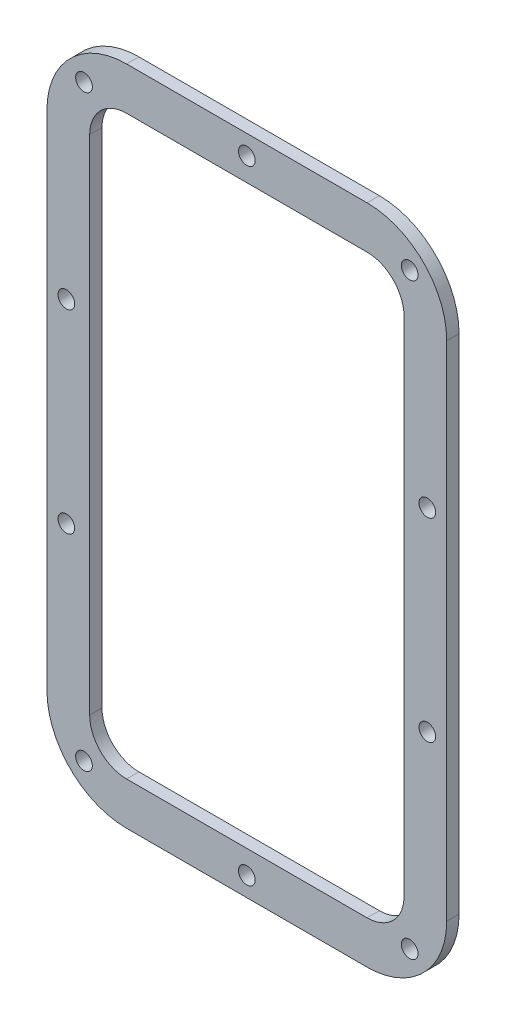
ISO-10303-21;
HEADER;
FILE_DESCRIPTION(('STEP AP214'),'2;1');
FILE_NAME('part.step','',(''),(''),'','','');
FILE_SCHEMA(('AUTOMOTIVE_DESIGN { 1 0 10303 214 1 1 1 1 }'));
ENDSEC;
DATA;
#1=APPLICATION_CONTEXT('core data for automotive mechanical design processes');
#2=APPLICATION_PROTOCOL_DEFINITION('international standard','automotive_design',2000,#1);
#3=PRODUCT_CONTEXT('',#1,'mechanical');
#4=PRODUCT('Part','Part','',(#3));
#5=PRODUCT_RELATED_PRODUCT_CATEGORY('part','',(#4));
#6=PRODUCT_DEFINITION_FORMATION('','',#4);
#7=PRODUCT_DEFINITION_CONTEXT('part definition',#1,'design');
#8=PRODUCT_DEFINITION('design','',#6,#7);
#9=PRODUCT_DEFINITION_SHAPE('','',#8);
#10=(LENGTH_UNIT() NAMED_UNIT(*) SI_UNIT(.MILLI.,.METRE.));
#11=(NAMED_UNIT(*) PLANE_ANGLE_UNIT() SI_UNIT($,.RADIAN.));
#12=(NAMED_UNIT(*) SI_UNIT($,.STERADIAN.) SOLID_ANGLE_UNIT());
#13=UNCERTAINTY_MEASURE_WITH_UNIT(LENGTH_MEASURE(1.E-05),#10,'distance_accuracy_value','');
#14=(GEOMETRIC_REPRESENTATION_CONTEXT(3) GLOBAL_UNCERTAINTY_ASSIGNED_CONTEXT((#13)) GLOBAL_UNIT_ASSIGNED_CONTEXT((#10,
#11,#12)) REPRESENTATION_CONTEXT('',''));
#15=CARTESIAN_POINT('',(0.,0.,0.));
#16=DIRECTION('',(0.,0.,1.));
#17=DIRECTION('',(1.,0.,0.));
#18=AXIS2_PLACEMENT_3D('',#15,#16,#17);
#19=CARTESIAN_POINT('',(32.5,-5.36127516449335,6.175));
#20=DIRECTION('',(0.,0.,1.));
#21=DIRECTION('',(1.,0.,0.));
#22=AXIS2_PLACEMENT_3D('',#19,#20,#21);
#23=PLANE('',#22);
#24=CARTESIAN_POINT('',(43.4601551083916,135.010155103898,6.175));
#25=DIRECTION('',(0.,0.,1.));
#26=DIRECTION('',(1.,0.,0.));
#27=AXIS2_PLACEMENT_3D('',#24,#25,#26);
#28=CIRCLE('',#27,2.15000000000003);
#29=CARTESIAN_POINT('',(45.6101551083916,135.010155103898,6.175));
#30=VERTEX_POINT('',#29);
#31=EDGE_CURVE('E218',#30,#30,#28,.T.);
#32=ORIENTED_EDGE('',*,*,#31,.F.);
#33=EDGE_LOOP('',(#32));
#34=FACE_BOUND('',#33,.T.);
#35=CARTESIAN_POINT('',(43.4601551083916,-16.3214302728847,6.175));
#36=DIRECTION('',(0.,0.,1.));
#37=DIRECTION('',(1.,0.,0.));
#38=AXIS2_PLACEMENT_3D('',#35,#36,#37);
#39=CIRCLE('',#38,2.15);
#40=CARTESIAN_POINT('',(45.6101551083916,-16.3214302728847,6.175));
#41=VERTEX_POINT('',#40);
#42=EDGE_CURVE('E230',#41,#41,#39,.T.);
#43=ORIENTED_EDGE('',*,*,#42,.F.);
#44=EDGE_LOOP('',(#43));
#45=FACE_BOUND('',#44,.T.);
#46=CARTESIAN_POINT('',(-40.3834791264749,-16.3214302728847,6.175));
#47=DIRECTION('',(0.,0.,1.));
#48=DIRECTION('',(1.,0.,0.));
#49=AXIS2_PLACEMENT_3D('',#46,#47,#48);
#50=CIRCLE('',#49,2.15);
#51=CARTESIAN_POINT('',(-38.2334791264749,-16.3214302728847,6.175));
#52=VERTEX_POINT('',#51);
#53=EDGE_CURVE('E242',#52,#52,#50,.T.);
#54=ORIENTED_EDGE('',*,*,#53,.F.);
#55=EDGE_LOOP('',(#54));
#56=FACE_BOUND('',#55,.T.);
#57=CARTESIAN_POINT('',(-40.3834791264749,135.010155103898,6.175));
#58=DIRECTION('',(0.,0.,1.));
#59=DIRECTION('',(1.,0.,0.));
#60=AXIS2_PLACEMENT_3D('',#57,#58,#59);
#61=CIRCLE('',#60,2.15000000000003);
#62=CARTESIAN_POINT('',(-38.2334791264749,135.010155103898,6.175));
#63=VERTEX_POINT('',#62);
#64=EDGE_CURVE('E254',#63,#63,#61,.T.);
#65=ORIENTED_EDGE('',*,*,#64,.F.);
#66=EDGE_LOOP('',(#65));
#67=FACE_BOUND('',#66,.T.);
#68=CARTESIAN_POINT('',(1.53833799095834,139.549999995507,6.175));
#69=DIRECTION('',(0.,0.,1.));
#70=DIRECTION('',(1.,0.,0.));
#71=AXIS2_PLACEMENT_3D('',#68,#69,#70);
#72=CIRCLE('',#71,2.14999999999997);
#73=CARTESIAN_POINT('',(3.68833799095831,139.549999995507,6.175));
#74=VERTEX_POINT('',#73);
#75=EDGE_CURVE('E266',#74,#74,#72,.T.);
#76=ORIENTED_EDGE('',*,*,#75,.F.);
#77=EDGE_LOOP('',(#76));
#78=FACE_BOUND('',#77,.T.);
#79=CARTESIAN_POINT('',(32.5,-5.36127516449335,6.175));
#80=DIRECTION('',(0.,0.,1.));
#81=DIRECTION('',(1.,0.,0.));
#82=AXIS2_PLACEMENT_3D('',#79,#80,#81);
#83=CIRCLE('',#82,20.5);
#84=CARTESIAN_POINT('',(32.5000000000273,-25.8612751645384,6.175));
#85=VERTEX_POINT('',#84);
#86=CARTESIAN_POINT('',(53.0000000000129,-5.36127516448914,6.175));
#87=VERTEX_POINT('',#86);
#88=EDGE_CURVE('E272',#85,#87,#83,.T.);
#89=ORIENTED_EDGE('',*,*,#88,.T.);
#90=DIRECTION('',(0.,-1.,0.));
#91=VECTOR('',#90,1.);
#92=CARTESIAN_POINT('',(52.9999999999973,-291471.1,6.175));
#93=LINE('',#92,#91);
#94=CARTESIAN_POINT('',(53.,124.04999999552,6.175));
#95=VERTEX_POINT('',#94);
#96=EDGE_CURVE('E274',#95,#87,#93,.T.);
#97=ORIENTED_EDGE('',*,*,#96,.F.);
#98=CARTESIAN_POINT('',(32.5,124.049999995507,6.175));
#99=DIRECTION('',(0.,0.,1.));
#100=DIRECTION('',(1.,0.,0.));
#101=AXIS2_PLACEMENT_3D('',#98,#99,#100);
#102=CIRCLE('',#101,20.5);
#103=CARTESIAN_POINT('',(32.5000000000273,144.54999999549,6.175));
#104=VERTEX_POINT('',#103);
#105=EDGE_CURVE('E278',#95,#104,#102,.T.);
#106=ORIENTED_EDGE('',*,*,#105,.T.);
#107=DIRECTION('',(1.,0.,0.));
#108=VECTOR('',#107,1.);
#109=CARTESIAN_POINT('',(-400000.538337991,144.54999999549,6.175));
#110=LINE('',#109,#108);
#111=CARTESIAN_POINT('',(-29.4233240180688,144.549999995507,6.175));
#112=VERTEX_POINT('',#111);
#113=EDGE_CURVE('E280',#112,#104,#110,.T.);
#114=ORIENTED_EDGE('',*,*,#113,.F.);
#115=CARTESIAN_POINT('',(-29.4233240180834,124.049999995507,6.175));
#116=DIRECTION('',(0.,0.,1.));
#117=DIRECTION('',(1.,0.,0.));
#118=AXIS2_PLACEMENT_3D('',#115,#116,#117);
#119=CIRCLE('',#118,20.5);
#120=CARTESIAN_POINT('',(-49.9233240180956,124.04999999552,6.175));
#121=VERTEX_POINT('',#120);
#122=EDGE_CURVE('E283',#112,#121,#119,.T.);
#123=ORIENTED_EDGE('',*,*,#122,.T.);
#124=DIRECTION('',(0.,1.,0.));
#125=VECTOR('',#124,1.);
#126=CARTESIAN_POINT('',(-49.9233240180956,-291471.1,6.175));
#127=LINE('',#126,#125);
#128=CARTESIAN_POINT('',(-49.9233240180834,-5.36127516448915,6.175));
#129=VERTEX_POINT('',#128);
#130=EDGE_CURVE('E285',#129,#121,#127,.T.);
#131=ORIENTED_EDGE('',*,*,#130,.F.);
#132=CARTESIAN_POINT('',(-29.4233240180834,-5.36127516449333,6.175));
#133=DIRECTION('',(0.,0.,1.));
#134=DIRECTION('',(1.,0.,0.));
#135=AXIS2_PLACEMENT_3D('',#132,#133,#134);
#136=CIRCLE('',#135,20.5);
#137=CARTESIAN_POINT('',(-29.4233240181256,-25.8612751645384,6.175));
#138=VERTEX_POINT('',#137);
#139=EDGE_CURVE('E288',#129,#138,#136,.T.);
#140=ORIENTED_EDGE('',*,*,#139,.T.);
#141=DIRECTION('',(-1.,0.,0.));
#142=VECTOR('',#141,1.);
#143=CARTESIAN_POINT('',(-400000.538337991,-25.861275164516,6.175));
#144=LINE('',#143,#142);
#145=EDGE_CURVE('E290',#85,#138,#144,.T.);
#146=ORIENTED_EDGE('',*,*,#145,.F.);
#147=EDGE_LOOP('',(#89,#97,#106,#114,#123,#131,#140,#146));
#148=FACE_BOUND('',#147,.T.);
#149=CARTESIAN_POINT('',(-44.9233240180834,84.3443624155067,6.175));
#150=DIRECTION('',(0.,0.,1.));
#151=DIRECTION('',(1.,0.,0.));
#152=AXIS2_PLACEMENT_3D('',#149,#150,#151);
#153=CIRCLE('',#152,2.15);
#154=CARTESIAN_POINT('',(-42.7733240180834,84.3443624155067,6.175));
#155=VERTEX_POINT('',#154);
#156=EDGE_CURVE('E260',#155,#155,#153,.T.);
#157=ORIENTED_EDGE('',*,*,#156,.F.);
#158=EDGE_LOOP('',(#157));
#159=FACE_BOUND('',#158,.T.);
#160=CARTESIAN_POINT('',(-44.9233240180834,34.3443624155067,6.175));
#161=DIRECTION('',(0.,0.,1.));
#162=DIRECTION('',(1.,0.,0.));
#163=AXIS2_PLACEMENT_3D('',#160,#161,#162);
#164=CIRCLE('',#163,2.15);
#165=CARTESIAN_POINT('',(-42.7733240180834,34.3443624155067,6.175));
#166=VERTEX_POINT('',#165);
#167=EDGE_CURVE('E248',#166,#166,#164,.T.);
#168=ORIENTED_EDGE('',*,*,#167,.F.);
#169=EDGE_LOOP('',(#168));
#170=FACE_BOUND('',#169,.T.);
#171=CARTESIAN_POINT('',(1.53833799095834,-20.8612751644933,6.175));
#172=DIRECTION('',(0.,0.,1.));
#173=DIRECTION('',(1.,0.,0.));
#174=AXIS2_PLACEMENT_3D('',#171,#172,#173);
#175=CIRCLE('',#174,2.15);
#176=CARTESIAN_POINT('',(3.68833799095834,-20.8612751644933,6.175));
#177=VERTEX_POINT('',#176);
#178=EDGE_CURVE('E236',#177,#177,#175,.T.);
#179=ORIENTED_EDGE('',*,*,#178,.F.);
#180=EDGE_LOOP('',(#179));
#181=FACE_BOUND('',#180,.T.);
#182=CARTESIAN_POINT('',(48.,34.3443624155066,6.175));
#183=DIRECTION('',(0.,0.,1.));
#184=DIRECTION('',(1.,0.,0.));
#185=AXIS2_PLACEMENT_3D('',#182,#183,#184);
#186=CIRCLE('',#185,2.15);
#187=CARTESIAN_POINT('',(50.15,34.3443624155066,6.175));
#188=VERTEX_POINT('',#187);
#189=EDGE_CURVE('E224',#188,#188,#186,.T.);
#190=ORIENTED_EDGE('',*,*,#189,.F.);
#191=EDGE_LOOP('',(#190));
#192=FACE_BOUND('',#191,.T.);
#193=CARTESIAN_POINT('',(48.,84.3443624155067,6.175));
#194=DIRECTION('',(0.,0.,1.));
#195=DIRECTION('',(1.,0.,0.));
#196=AXIS2_PLACEMENT_3D('',#193,#194,#195);
#197=CIRCLE('',#196,2.15);
#198=CARTESIAN_POINT('',(50.15,84.3443624155067,6.175));
#199=VERTEX_POINT('',#198);
#200=EDGE_CURVE('E212',#199,#199,#197,.T.);
#201=ORIENTED_EDGE('',*,*,#200,.F.);
#202=EDGE_LOOP('',(#201));
#203=FACE_BOUND('',#202,.T.);
#204=DIRECTION('',(0.,-1.,0.));
#205=VECTOR('',#204,1.);
#206=CARTESIAN_POINT('',(41.9999999999732,-291471.1,6.175));
#207=LINE('',#206,#205);
#208=CARTESIAN_POINT('',(42.,124.04999999552,6.175));
#209=VERTEX_POINT('',#208);
#210=CARTESIAN_POINT('',(41.9999999999732,-5.36127516448914,6.175));
#211=VERTEX_POINT('',#210);
#212=EDGE_CURVE('E155',#209,#211,#207,.T.);
#213=ORIENTED_EDGE('',*,*,#212,.T.);
#214=CARTESIAN_POINT('',(32.5000000000001,-5.36127516449332,6.175));
#215=DIRECTION('',(0.,0.,1.));
#216=DIRECTION('',(1.,0.,0.));
#217=AXIS2_PLACEMENT_3D('',#214,#215,#216);
#218=CIRCLE('',#217,9.5);
#219=CARTESIAN_POINT('',(32.5000000000273,-14.8612751644703,6.175));
#220=VERTEX_POINT('',#219);
#221=EDGE_CURVE('E146',#220,#211,#218,.T.);
#222=ORIENTED_EDGE('',*,*,#221,.F.);
#223=DIRECTION('',(-1.,0.,0.));
#224=VECTOR('',#223,1.);
#225=CARTESIAN_POINT('',(-400000.538337991,-14.8612751645487,6.175));
#226=LINE('',#225,#224);
#227=CARTESIAN_POINT('',(-29.4233240181256,-14.8612751644703,6.175));
#228=VERTEX_POINT('',#227);
#229=EDGE_CURVE('E181',#220,#228,#226,.T.);
#230=ORIENTED_EDGE('',*,*,#229,.T.);
#231=CARTESIAN_POINT('',(-29.4233240180833,-5.36127516449333,6.175));
#232=DIRECTION('',(0.,0.,1.));
#233=DIRECTION('',(1.,0.,0.));
#234=AXIS2_PLACEMENT_3D('',#231,#232,#233);
#235=CIRCLE('',#234,9.5);
#236=CARTESIAN_POINT('',(-38.9233240180833,-5.36127516448914,6.175));
#237=VERTEX_POINT('',#236);
#238=EDGE_CURVE('E179',#237,#228,#235,.T.);
#239=ORIENTED_EDGE('',*,*,#238,.F.);
#240=DIRECTION('',(0.,1.,0.));
#241=VECTOR('',#240,1.);
#242=CARTESIAN_POINT('',(-38.9233240180147,-291471.1,6.175));
#243=LINE('',#242,#241);
#244=CARTESIAN_POINT('',(-38.9233240180772,124.04999999552,6.175));
#245=VERTEX_POINT('',#244);
#246=EDGE_CURVE('E176',#237,#245,#243,.T.);
#247=ORIENTED_EDGE('',*,*,#246,.T.);
#248=CARTESIAN_POINT('',(-29.4233240180834,124.049999995507,6.175));
#249=DIRECTION('',(0.,0.,1.));
#250=DIRECTION('',(1.,0.,0.));
#251=AXIS2_PLACEMENT_3D('',#248,#249,#250);
#252=CIRCLE('',#251,9.5);
#253=CARTESIAN_POINT('',(-29.4233240180688,133.549999995507,6.175));
#254=VERTEX_POINT('',#253);
#255=EDGE_CURVE('E174',#254,#245,#252,.T.);
#256=ORIENTED_EDGE('',*,*,#255,.F.);
#257=DIRECTION('',(1.,0.,0.));
#258=VECTOR('',#257,1.);
#259=CARTESIAN_POINT('',(-400000.538337991,133.549999995523,6.175));
#260=LINE('',#259,#258);
#261=CARTESIAN_POINT('',(32.5000000000273,133.549999995523,6.175));
#262=VERTEX_POINT('',#261);
#263=EDGE_CURVE('E170',#254,#262,#260,.T.);
#264=ORIENTED_EDGE('',*,*,#263,.T.);
#265=CARTESIAN_POINT('',(32.5000000000001,124.049999995507,6.175));
#266=DIRECTION('',(0.,0.,1.));
#267=DIRECTION('',(1.,0.,0.));
#268=AXIS2_PLACEMENT_3D('',#265,#266,#267);
#269=CIRCLE('',#268,9.49999999999999);
#270=EDGE_CURVE('E168',#209,#262,#269,.T.);
#271=ORIENTED_EDGE('',*,*,#270,.F.);
#272=EDGE_LOOP('',(#213,#222,#230,#239,#247,#256,#264,#271));
#273=FACE_BOUND('',#272,.T.);
#274=ADVANCED_FACE('F35',(#34,#45,#56,#67,#78,#148,#159,#170,#181,#192,#203,#273),#23,.T.);
#275=CARTESIAN_POINT('',(32.5,-5.36127516449335,3.));
#276=DIRECTION('',(0.,0.,1.));
#277=DIRECTION('',(1.,0.,0.));
#278=AXIS2_PLACEMENT_3D('',#275,#276,#277);
#279=PLANE('',#278);
#280=CARTESIAN_POINT('',(48.,84.3443624155067,3.));
#281=DIRECTION('',(0.,0.,1.));
#282=DIRECTION('',(1.,0.,0.));
#283=AXIS2_PLACEMENT_3D('',#280,#281,#282);
#284=CIRCLE('',#283,2.15);
#285=CARTESIAN_POINT('',(50.15,84.3443624155067,3.));
#286=VERTEX_POINT('',#285);
#287=EDGE_CURVE('E164',#286,#286,#284,.T.);
#288=ORIENTED_EDGE('',*,*,#287,.T.);
#289=EDGE_LOOP('',(#288));
#290=FACE_BOUND('',#289,.T.);
#291=CARTESIAN_POINT('',(43.4601551083916,135.010155103898,3.));
#292=DIRECTION('',(0.,0.,1.));
#293=DIRECTION('',(1.,0.,0.));
#294=AXIS2_PLACEMENT_3D('',#291,#292,#293);
#295=CIRCLE('',#294,2.15000000000003);
#296=CARTESIAN_POINT('',(45.6101551083916,135.010155103898,3.));
#297=VERTEX_POINT('',#296);
#298=EDGE_CURVE('E215',#297,#297,#295,.T.);
#299=ORIENTED_EDGE('',*,*,#298,.T.);
#300=EDGE_LOOP('',(#299));
#301=FACE_BOUND('',#300,.T.);
#302=CARTESIAN_POINT('',(48.,34.3443624155066,3.));
#303=DIRECTION('',(0.,0.,1.));
#304=DIRECTION('',(1.,0.,0.));
#305=AXIS2_PLACEMENT_3D('',#302,#303,#304);
#306=CIRCLE('',#305,2.15);
#307=CARTESIAN_POINT('',(50.15,34.3443624155066,3.));
#308=VERTEX_POINT('',#307);
#309=EDGE_CURVE('E221',#308,#308,#306,.T.);
#310=ORIENTED_EDGE('',*,*,#309,.T.);
#311=EDGE_LOOP('',(#310));
#312=FACE_BOUND('',#311,.T.);
#313=CARTESIAN_POINT('',(43.4601551083916,-16.3214302728847,3.));
#314=DIRECTION('',(0.,0.,1.));
#315=DIRECTION('',(1.,0.,0.));
#316=AXIS2_PLACEMENT_3D('',#313,#314,#315);
#317=CIRCLE('',#316,2.15);
#318=CARTESIAN_POINT('',(45.6101551083916,-16.3214302728847,3.));
#319=VERTEX_POINT('',#318);
#320=EDGE_CURVE('E227',#319,#319,#317,.T.);
#321=ORIENTED_EDGE('',*,*,#320,.T.);
#322=EDGE_LOOP('',(#321));
#323=FACE_BOUND('',#322,.T.);
#324=CARTESIAN_POINT('',(1.53833799095834,-20.8612751644933,3.));
#325=DIRECTION('',(0.,0.,1.));
#326=DIRECTION('',(1.,0.,0.));
#327=AXIS2_PLACEMENT_3D('',#324,#325,#326);
#328=CIRCLE('',#327,2.15);
#329=CARTESIAN_POINT('',(3.68833799095834,-20.8612751644933,3.));
#330=VERTEX_POINT('',#329);
#331=EDGE_CURVE('E233',#330,#330,#328,.T.);
#332=ORIENTED_EDGE('',*,*,#331,.T.);
#333=EDGE_LOOP('',(#332));
#334=FACE_BOUND('',#333,.T.);
#335=CARTESIAN_POINT('',(-40.3834791264749,-16.3214302728847,3.));
#336=DIRECTION('',(0.,0.,1.));
#337=DIRECTION('',(1.,0.,0.));
#338=AXIS2_PLACEMENT_3D('',#335,#336,#337);
#339=CIRCLE('',#338,2.15);
#340=CARTESIAN_POINT('',(-38.2334791264749,-16.3214302728847,3.));
#341=VERTEX_POINT('',#340);
#342=EDGE_CURVE('E239',#341,#341,#339,.T.);
#343=ORIENTED_EDGE('',*,*,#342,.T.);
#344=EDGE_LOOP('',(#343));
#345=FACE_BOUND('',#344,.T.);
#346=CARTESIAN_POINT('',(-44.9233240180834,34.3443624155067,3.));
#347=DIRECTION('',(0.,0.,1.));
#348=DIRECTION('',(1.,0.,0.));
#349=AXIS2_PLACEMENT_3D('',#346,#347,#348);
#350=CIRCLE('',#349,2.15);
#351=CARTESIAN_POINT('',(-42.7733240180834,34.3443624155067,3.));
#352=VERTEX_POINT('',#351);
#353=EDGE_CURVE('E245',#352,#352,#350,.T.);
#354=ORIENTED_EDGE('',*,*,#353,.T.);
#355=EDGE_LOOP('',(#354));
#356=FACE_BOUND('',#355,.T.);
#357=CARTESIAN_POINT('',(-40.3834791264749,135.010155103898,3.));
#358=DIRECTION('',(0.,0.,1.));
#359=DIRECTION('',(1.,0.,0.));
#360=AXIS2_PLACEMENT_3D('',#357,#358,#359);
#361=CIRCLE('',#360,2.15000000000003);
#362=CARTESIAN_POINT('',(-38.2334791264749,135.010155103898,3.));
#363=VERTEX_POINT('',#362);
#364=EDGE_CURVE('E251',#363,#363,#361,.T.);
#365=ORIENTED_EDGE('',*,*,#364,.T.);
#366=EDGE_LOOP('',(#365));
#367=FACE_BOUND('',#366,.T.);
#368=CARTESIAN_POINT('',(-44.9233240180834,84.3443624155067,3.));
#369=DIRECTION('',(0.,0.,1.));
#370=DIRECTION('',(1.,0.,0.));
#371=AXIS2_PLACEMENT_3D('',#368,#369,#370);
#372=CIRCLE('',#371,2.15);
#373=CARTESIAN_POINT('',(-42.7733240180834,84.3443624155067,3.));
#374=VERTEX_POINT('',#373);
#375=EDGE_CURVE('E257',#374,#374,#372,.T.);
#376=ORIENTED_EDGE('',*,*,#375,.T.);
#377=EDGE_LOOP('',(#376));
#378=FACE_BOUND('',#377,.T.);
#379=CARTESIAN_POINT('',(1.53833799095834,139.549999995507,3.));
#380=DIRECTION('',(0.,0.,1.));
#381=DIRECTION('',(1.,0.,0.));
#382=AXIS2_PLACEMENT_3D('',#379,#380,#381);
#383=CIRCLE('',#382,2.14999999999997);
#384=CARTESIAN_POINT('',(3.68833799095831,139.549999995507,3.));
#385=VERTEX_POINT('',#384);
#386=EDGE_CURVE('E263',#385,#385,#383,.T.);
#387=ORIENTED_EDGE('',*,*,#386,.T.);
#388=EDGE_LOOP('',(#387));
#389=FACE_BOUND('',#388,.T.);
#390=CARTESIAN_POINT('',(32.5,-5.36127516449335,3.));
#391=DIRECTION('',(0.,0.,1.));
#392=DIRECTION('',(1.,0.,0.));
#393=AXIS2_PLACEMENT_3D('',#390,#391,#392);
#394=CIRCLE('',#393,20.5);
#395=CARTESIAN_POINT('',(32.5000000000273,-25.8612751645384,3.));
#396=VERTEX_POINT('',#395);
#397=CARTESIAN_POINT('',(53.0000000000129,-5.36127516448914,3.));
#398=VERTEX_POINT('',#397);
#399=EDGE_CURVE('E269',#396,#398,#394,.T.);
#400=ORIENTED_EDGE('',*,*,#399,.F.);
#401=DIRECTION('',(-1.,0.,0.));
#402=VECTOR('',#401,1.);
#403=CARTESIAN_POINT('',(-400000.538337991,-25.861275164516,3.));
#404=LINE('',#403,#402);
#405=CARTESIAN_POINT('',(-29.4233240181256,-25.8612751645384,3.));
#406=VERTEX_POINT('',#405);
#407=EDGE_CURVE('E275',#396,#406,#404,.T.);
#408=ORIENTED_EDGE('',*,*,#407,.T.);
#409=CARTESIAN_POINT('',(-29.4233240180834,-5.36127516449333,3.));
#410=DIRECTION('',(0.,0.,1.));
#411=DIRECTION('',(1.,0.,0.));
#412=AXIS2_PLACEMENT_3D('',#409,#410,#411);
#413=CIRCLE('',#412,20.5);
#414=CARTESIAN_POINT('',(-49.9233240180834,-5.36127516448915,3.));
#415=VERTEX_POINT('',#414);
#416=EDGE_CURVE('E311',#415,#406,#413,.T.);
#417=ORIENTED_EDGE('',*,*,#416,.F.);
#418=DIRECTION('',(0.,1.,0.));
#419=VECTOR('',#418,1.);
#420=CARTESIAN_POINT('',(-49.9233240180956,-291471.1,3.));
#421=LINE('',#420,#419);
#422=CARTESIAN_POINT('',(-49.9233240180956,124.04999999552,3.));
#423=VERTEX_POINT('',#422);
#424=EDGE_CURVE('E308',#415,#423,#421,.T.);
#425=ORIENTED_EDGE('',*,*,#424,.T.);
#426=CARTESIAN_POINT('',(-29.4233240180834,124.049999995507,3.));
#427=DIRECTION('',(0.,0.,1.));
#428=DIRECTION('',(1.,0.,0.));
#429=AXIS2_PLACEMENT_3D('',#426,#427,#428);
#430=CIRCLE('',#429,20.5);
#431=CARTESIAN_POINT('',(-29.4233240180688,144.549999995507,3.));
#432=VERTEX_POINT('',#431);
#433=EDGE_CURVE('E305',#432,#423,#430,.T.);
#434=ORIENTED_EDGE('',*,*,#433,.F.);
#435=DIRECTION('',(1.,0.,0.));
#436=VECTOR('',#435,1.);
#437=CARTESIAN_POINT('',(-400000.538337991,144.54999999549,3.));
#438=LINE('',#437,#436);
#439=CARTESIAN_POINT('',(32.5000000000273,144.54999999549,3.));
#440=VERTEX_POINT('',#439);
#441=EDGE_CURVE('E302',#432,#440,#438,.T.);
#442=ORIENTED_EDGE('',*,*,#441,.T.);
#443=CARTESIAN_POINT('',(32.5,124.049999995507,3.));
#444=DIRECTION('',(0.,0.,1.));
#445=DIRECTION('',(1.,0.,0.));
#446=AXIS2_PLACEMENT_3D('',#443,#444,#445);
#447=CIRCLE('',#446,20.5);
#448=CARTESIAN_POINT('',(53.,124.04999999552,3.));
#449=VERTEX_POINT('',#448);
#450=EDGE_CURVE('E299',#449,#440,#447,.T.);
#451=ORIENTED_EDGE('',*,*,#450,.F.);
#452=DIRECTION('',(0.,-1.,0.));
#453=VECTOR('',#452,1.);
#454=CARTESIAN_POINT('',(52.9999999999973,-291471.1,3.));
#455=LINE('',#454,#453);
#456=EDGE_CURVE('E296',#449,#398,#455,.T.);
#457=ORIENTED_EDGE('',*,*,#456,.T.);
#458=EDGE_LOOP('',(#400,#408,#417,#425,#434,#442,#451,#457));
#459=FACE_BOUND('',#458,.T.);
#460=CARTESIAN_POINT('',(32.5000000000001,-5.36127516449332,3.));
#461=DIRECTION('',(0.,0.,1.));
#462=DIRECTION('',(1.,0.,0.));
#463=AXIS2_PLACEMENT_3D('',#460,#461,#462);
#464=CIRCLE('',#463,9.5);
#465=CARTESIAN_POINT('',(32.5000000000273,-14.8612751644703,3.));
#466=VERTEX_POINT('',#465);
#467=CARTESIAN_POINT('',(41.9999999999732,-5.36127516448914,3.));
#468=VERTEX_POINT('',#467);
#469=EDGE_CURVE('E58',#466,#468,#464,.T.);
#470=ORIENTED_EDGE('',*,*,#469,.T.);
#471=DIRECTION('',(0.,-1.,0.));
#472=VECTOR('',#471,1.);
#473=CARTESIAN_POINT('',(41.9999999999732,-291471.1,3.));
#474=LINE('',#473,#472);
#475=CARTESIAN_POINT('',(42.,124.04999999552,3.));
#476=VERTEX_POINT('',#475);
#477=EDGE_CURVE('E163',#476,#468,#474,.T.);
#478=ORIENTED_EDGE('',*,*,#477,.F.);
#479=CARTESIAN_POINT('',(32.5000000000001,124.049999995507,3.));
#480=DIRECTION('',(0.,0.,1.));
#481=DIRECTION('',(1.,0.,0.));
#482=AXIS2_PLACEMENT_3D('',#479,#480,#481);
#483=CIRCLE('',#482,9.49999999999999);
#484=CARTESIAN_POINT('',(32.5000000000273,133.549999995523,3.));
#485=VERTEX_POINT('',#484);
#486=EDGE_CURVE('E185',#476,#485,#483,.T.);
#487=ORIENTED_EDGE('',*,*,#486,.T.);
#488=DIRECTION('',(1.,0.,0.));
#489=VECTOR('',#488,1.);
#490=CARTESIAN_POINT('',(-400000.538337991,133.549999995523,3.));
#491=LINE('',#490,#489);
#492=CARTESIAN_POINT('',(-29.4233240180688,133.549999995507,3.));
#493=VERTEX_POINT('',#492);
#494=EDGE_CURVE('E188',#493,#485,#491,.T.);
#495=ORIENTED_EDGE('',*,*,#494,.F.);
#496=CARTESIAN_POINT('',(-29.4233240180834,124.049999995507,3.));
#497=DIRECTION('',(0.,0.,1.));
#498=DIRECTION('',(1.,0.,0.));
#499=AXIS2_PLACEMENT_3D('',#496,#497,#498);
#500=CIRCLE('',#499,9.5);
#501=CARTESIAN_POINT('',(-38.9233240180772,124.04999999552,3.));
#502=VERTEX_POINT('',#501);
#503=EDGE_CURVE('E191',#493,#502,#500,.T.);
#504=ORIENTED_EDGE('',*,*,#503,.T.);
#505=DIRECTION('',(0.,1.,0.));
#506=VECTOR('',#505,1.);
#507=CARTESIAN_POINT('',(-38.9233240180147,-291471.1,3.));
#508=LINE('',#507,#506);
#509=CARTESIAN_POINT('',(-38.9233240180833,-5.36127516448914,3.));
#510=VERTEX_POINT('',#509);
#511=EDGE_CURVE('E194',#510,#502,#508,.T.);
#512=ORIENTED_EDGE('',*,*,#511,.F.);
#513=CARTESIAN_POINT('',(-29.4233240180833,-5.36127516449333,3.));
#514=DIRECTION('',(0.,0.,1.));
#515=DIRECTION('',(1.,0.,0.));
#516=AXIS2_PLACEMENT_3D('',#513,#514,#515);
#517=CIRCLE('',#516,9.5);
#518=CARTESIAN_POINT('',(-29.4233240181256,-14.8612751644703,3.));
#519=VERTEX_POINT('',#518);
#520=EDGE_CURVE('E197',#510,#519,#517,.T.);
#521=ORIENTED_EDGE('',*,*,#520,.T.);
#522=DIRECTION('',(-1.,0.,0.));
#523=VECTOR('',#522,1.);
#524=CARTESIAN_POINT('',(-400000.538337991,-14.8612751645487,3.));
#525=LINE('',#524,#523);
#526=EDGE_CURVE('E156',#466,#519,#525,.T.);
#527=ORIENTED_EDGE('',*,*,#526,.F.);
#528=EDGE_LOOP('',(#470,#478,#487,#495,#504,#512,#521,#527));
#529=FACE_BOUND('',#528,.T.);
#530=ADVANCED_FACE('F336',(#290,#301,#312,#323,#334,#345,#356,#367,#378,#389,#459,#529),#279,.F.);
#531=CARTESIAN_POINT('',(32.5,-5.36127516449335,6.175));
#532=DIRECTION('',(0.,0.,-1.));
#533=DIRECTION('',(-1.,0.,0.));
#534=AXIS2_PLACEMENT_3D('',#531,#532,#533);
#535=CYLINDRICAL_SURFACE('',#534,20.5);
#536=ORIENTED_EDGE('',*,*,#399,.T.);
#537=DIRECTION('',(0.,0.,-1.));
#538=VECTOR('',#537,1.);
#539=CARTESIAN_POINT('',(53.0000000000129,-5.36127516448914,6.175));
#540=LINE('',#539,#538);
#541=EDGE_CURVE('E11',#87,#398,#540,.T.);
#542=ORIENTED_EDGE('',*,*,#541,.F.);
#543=ORIENTED_EDGE('',*,*,#88,.F.);
#544=DIRECTION('',(0.,0.,-1.));
#545=VECTOR('',#544,1.);
#546=CARTESIAN_POINT('',(32.5000000000273,-25.8612751645384,6.175));
#547=LINE('',#546,#545);
#548=EDGE_CURVE('E293',#85,#396,#547,.T.);
#549=ORIENTED_EDGE('',*,*,#548,.T.);
#550=EDGE_LOOP('',(#536,#542,#543,#549));
#551=FACE_BOUND('',#550,.T.);
#552=ADVANCED_FACE('F37',(#551),#535,.T.);
#553=CARTESIAN_POINT('',(52.9999999999973,-291471.1,6.175));
#554=DIRECTION('',(1.,0.,0.));
#555=DIRECTION('',(0.,1.,0.));
#556=AXIS2_PLACEMENT_3D('',#553,#554,#555);
#557=PLANE('',#556);
#558=ORIENTED_EDGE('',*,*,#456,.F.);
#559=DIRECTION('',(0.,0.,-1.));
#560=VECTOR('',#559,1.);
#561=CARTESIAN_POINT('',(53.,124.04999999552,6.175));
#562=LINE('',#561,#560);
#563=EDGE_CURVE('E43',#95,#449,#562,.T.);
#564=ORIENTED_EDGE('',*,*,#563,.F.);
#565=ORIENTED_EDGE('',*,*,#96,.T.);
#566=ORIENTED_EDGE('',*,*,#541,.T.);
#567=EDGE_LOOP('',(#558,#564,#565,#566));
#568=FACE_BOUND('',#567,.T.);
#569=ADVANCED_FACE('F340',(#568),#557,.T.);
#570=CARTESIAN_POINT('',(32.5,124.049999995507,6.175));
#571=DIRECTION('',(0.,0.,-1.));
#572=DIRECTION('',(-1.,0.,0.));
#573=AXIS2_PLACEMENT_3D('',#570,#571,#572);
#574=CYLINDRICAL_SURFACE('',#573,20.5);
#575=ORIENTED_EDGE('',*,*,#450,.T.);
#576=DIRECTION('',(0.,0.,-1.));
#577=VECTOR('',#576,1.);
#578=CARTESIAN_POINT('',(32.5000000000273,144.54999999549,6.175));
#579=LINE('',#578,#577);
#580=EDGE_CURVE('E325',#104,#440,#579,.T.);
#581=ORIENTED_EDGE('',*,*,#580,.F.);
#582=ORIENTED_EDGE('',*,*,#105,.F.);
#583=ORIENTED_EDGE('',*,*,#563,.T.);
#584=EDGE_LOOP('',(#575,#581,#582,#583));
#585=FACE_BOUND('',#584,.T.);
#586=ADVANCED_FACE('F329',(#585),#574,.T.);
#587=CARTESIAN_POINT('',(-400000.538337991,144.54999999549,6.175));
#588=DIRECTION('',(0.,1.,0.));
#589=DIRECTION('',(0.,0.,1.));
#590=AXIS2_PLACEMENT_3D('',#587,#588,#589);
#591=PLANE('',#590);
#592=ORIENTED_EDGE('',*,*,#441,.F.);
#593=DIRECTION('',(0.,0.,-1.));
#594=VECTOR('',#593,1.);
#595=CARTESIAN_POINT('',(-29.4233240180688,144.549999995507,6.175));
#596=LINE('',#595,#594);
#597=EDGE_CURVE('E323',#112,#432,#596,.T.);
#598=ORIENTED_EDGE('',*,*,#597,.F.);
#599=ORIENTED_EDGE('',*,*,#113,.T.);
#600=ORIENTED_EDGE('',*,*,#580,.T.);
#601=EDGE_LOOP('',(#592,#598,#599,#600));
#602=FACE_BOUND('',#601,.T.);
#603=ADVANCED_FACE('F362',(#602),#591,.T.);
#604=CARTESIAN_POINT('',(-29.4233240180834,124.049999995507,6.175));
#605=DIRECTION('',(0.,0.,-1.));
#606=DIRECTION('',(-1.,0.,0.));
#607=AXIS2_PLACEMENT_3D('',#604,#605,#606);
#608=CYLINDRICAL_SURFACE('',#607,20.5);
#609=ORIENTED_EDGE('',*,*,#433,.T.);
#610=DIRECTION('',(0.,0.,-1.));
#611=VECTOR('',#610,1.);
#612=CARTESIAN_POINT('',(-49.9233240180956,124.04999999552,6.175));
#613=LINE('',#612,#611);
#614=EDGE_CURVE('E321',#121,#423,#613,.T.);
#615=ORIENTED_EDGE('',*,*,#614,.F.);
#616=ORIENTED_EDGE('',*,*,#122,.F.);
#617=ORIENTED_EDGE('',*,*,#597,.T.);
#618=EDGE_LOOP('',(#609,#615,#616,#617));
#619=FACE_BOUND('',#618,.T.);
#620=ADVANCED_FACE('F360',(#619),#608,.T.);
#621=CARTESIAN_POINT('',(-49.9233240180956,-291471.1,6.175));
#622=DIRECTION('',(-1.,0.,0.));
#623=DIRECTION('',(0.,0.,1.));
#624=AXIS2_PLACEMENT_3D('',#621,#622,#623);
#625=PLANE('',#624);
#626=ORIENTED_EDGE('',*,*,#424,.F.);
#627=DIRECTION('',(0.,0.,-1.));
#628=VECTOR('',#627,1.);
#629=CARTESIAN_POINT('',(-49.9233240180834,-5.36127516448915,6.175));
#630=LINE('',#629,#628);
#631=EDGE_CURVE('E319',#129,#415,#630,.T.);
#632=ORIENTED_EDGE('',*,*,#631,.F.);
#633=ORIENTED_EDGE('',*,*,#130,.T.);
#634=ORIENTED_EDGE('',*,*,#614,.T.);
#635=EDGE_LOOP('',(#626,#632,#633,#634));
#636=FACE_BOUND('',#635,.T.);
#637=ADVANCED_FACE('F355',(#636),#625,.T.);
#638=CARTESIAN_POINT('',(-29.4233240180834,-5.36127516449333,6.175));
#639=DIRECTION('',(0.,0.,-1.));
#640=DIRECTION('',(-1.,0.,0.));
#641=AXIS2_PLACEMENT_3D('',#638,#639,#640);
#642=CYLINDRICAL_SURFACE('',#641,20.5);
#643=ORIENTED_EDGE('',*,*,#416,.T.);
#644=DIRECTION('',(0.,0.,-1.));
#645=VECTOR('',#644,1.);
#646=CARTESIAN_POINT('',(-29.4233240181256,-25.8612751645384,6.175));
#647=LINE('',#646,#645);
#648=EDGE_CURVE('E317',#138,#406,#647,.T.);
#649=ORIENTED_EDGE('',*,*,#648,.F.);
#650=ORIENTED_EDGE('',*,*,#139,.F.);
#651=ORIENTED_EDGE('',*,*,#631,.T.);
#652=EDGE_LOOP('',(#643,#649,#650,#651));
#653=FACE_BOUND('',#652,.T.);
#654=ADVANCED_FACE('F352',(#653),#642,.T.);
#655=CARTESIAN_POINT('',(-400000.538337991,-25.861275164516,6.175));
#656=DIRECTION('',(0.,-1.,0.));
#657=DIRECTION('',(1.,0.,0.));
#658=AXIS2_PLACEMENT_3D('',#655,#656,#657);
#659=PLANE('',#658);
#660=ORIENTED_EDGE('',*,*,#407,.F.);
#661=ORIENTED_EDGE('',*,*,#548,.F.);
#662=ORIENTED_EDGE('',*,*,#145,.T.);
#663=ORIENTED_EDGE('',*,*,#648,.T.);
#664=EDGE_LOOP('',(#660,#661,#662,#663));
#665=FACE_BOUND('',#664,.T.);
#666=ADVANCED_FACE('F347',(#665),#659,.T.);
#667=CARTESIAN_POINT('',(1.53833799095834,139.549999995507,6.175));
#668=DIRECTION('',(0.,0.,-1.));
#669=DIRECTION('',(-1.,0.,0.));
#670=AXIS2_PLACEMENT_3D('',#667,#668,#669);
#671=CYLINDRICAL_SURFACE('',#670,2.14999999999997);
#672=ORIENTED_EDGE('',*,*,#75,.T.);
#673=EDGE_LOOP('',(#672));
#674=FACE_BOUND('',#673,.T.);
#675=ORIENTED_EDGE('',*,*,#386,.F.);
#676=EDGE_LOOP('',(#675));
#677=FACE_BOUND('',#676,.T.);
#678=ADVANCED_FACE('F407',(#674,#677),#671,.F.);
#679=CARTESIAN_POINT('',(-44.9233240180834,84.3443624155067,6.175));
#680=DIRECTION('',(0.,0.,-1.));
#681=DIRECTION('',(-1.,0.,0.));
#682=AXIS2_PLACEMENT_3D('',#679,#680,#681);
#683=CYLINDRICAL_SURFACE('',#682,2.15);
#684=ORIENTED_EDGE('',*,*,#156,.T.);
#685=EDGE_LOOP('',(#684));
#686=FACE_BOUND('',#685,.T.);
#687=ORIENTED_EDGE('',*,*,#375,.F.);
#688=EDGE_LOOP('',(#687));
#689=FACE_BOUND('',#688,.T.);
#690=ADVANCED_FACE('F409',(#686,#689),#683,.F.);
#691=CARTESIAN_POINT('',(-40.3834791264749,135.010155103898,6.175));
#692=DIRECTION('',(0.,0.,-1.));
#693=DIRECTION('',(-1.,0.,0.));
#694=AXIS2_PLACEMENT_3D('',#691,#692,#693);
#695=CYLINDRICAL_SURFACE('',#694,2.15000000000003);
#696=ORIENTED_EDGE('',*,*,#64,.T.);
#697=EDGE_LOOP('',(#696));
#698=FACE_BOUND('',#697,.T.);
#699=ORIENTED_EDGE('',*,*,#364,.F.);
#700=EDGE_LOOP('',(#699));
#701=FACE_BOUND('',#700,.T.);
#702=ADVANCED_FACE('F416',(#698,#701),#695,.F.);
#703=CARTESIAN_POINT('',(-44.9233240180834,34.3443624155067,6.175));
#704=DIRECTION('',(0.,0.,-1.));
#705=DIRECTION('',(-1.,0.,0.));
#706=AXIS2_PLACEMENT_3D('',#703,#704,#705);
#707=CYLINDRICAL_SURFACE('',#706,2.15);
#708=ORIENTED_EDGE('',*,*,#167,.T.);
#709=EDGE_LOOP('',(#708));
#710=FACE_BOUND('',#709,.T.);
#711=ORIENTED_EDGE('',*,*,#353,.F.);
#712=EDGE_LOOP('',(#711));
#713=FACE_BOUND('',#712,.T.);
#714=ADVANCED_FACE('F502',(#710,#713),#707,.F.);
#715=CARTESIAN_POINT('',(-40.3834791264749,-16.3214302728847,6.175));
#716=DIRECTION('',(0.,0.,-1.));
#717=DIRECTION('',(-1.,0.,0.));
#718=AXIS2_PLACEMENT_3D('',#715,#716,#717);
#719=CYLINDRICAL_SURFACE('',#718,2.15);
#720=ORIENTED_EDGE('',*,*,#53,.T.);
#721=EDGE_LOOP('',(#720));
#722=FACE_BOUND('',#721,.T.);
#723=ORIENTED_EDGE('',*,*,#342,.F.);
#724=EDGE_LOOP('',(#723));
#725=FACE_BOUND('',#724,.T.);
#726=ADVANCED_FACE('F510',(#722,#725),#719,.F.);
#727=CARTESIAN_POINT('',(1.53833799095834,-20.8612751644933,6.175));
#728=DIRECTION('',(0.,0.,-1.));
#729=DIRECTION('',(-1.,0.,0.));
#730=AXIS2_PLACEMENT_3D('',#727,#728,#729);
#731=CYLINDRICAL_SURFACE('',#730,2.15);
#732=ORIENTED_EDGE('',*,*,#178,.T.);
#733=EDGE_LOOP('',(#732));
#734=FACE_BOUND('',#733,.T.);
#735=ORIENTED_EDGE('',*,*,#331,.F.);
#736=EDGE_LOOP('',(#735));
#737=FACE_BOUND('',#736,.T.);
#738=ADVANCED_FACE('F519',(#734,#737),#731,.F.);
#739=CARTESIAN_POINT('',(43.4601551083916,-16.3214302728847,6.175));
#740=DIRECTION('',(0.,0.,-1.));
#741=DIRECTION('',(-1.,0.,0.));
#742=AXIS2_PLACEMENT_3D('',#739,#740,#741);
#743=CYLINDRICAL_SURFACE('',#742,2.15);
#744=ORIENTED_EDGE('',*,*,#42,.T.);
#745=EDGE_LOOP('',(#744));
#746=FACE_BOUND('',#745,.T.);
#747=ORIENTED_EDGE('',*,*,#320,.F.);
#748=EDGE_LOOP('',(#747));
#749=FACE_BOUND('',#748,.T.);
#750=ADVANCED_FACE('F528',(#746,#749),#743,.F.);
#751=CARTESIAN_POINT('',(48.,34.3443624155066,6.175));
#752=DIRECTION('',(0.,0.,-1.));
#753=DIRECTION('',(-1.,0.,0.));
#754=AXIS2_PLACEMENT_3D('',#751,#752,#753);
#755=CYLINDRICAL_SURFACE('',#754,2.15);
#756=ORIENTED_EDGE('',*,*,#189,.T.);
#757=EDGE_LOOP('',(#756));
#758=FACE_BOUND('',#757,.T.);
#759=ORIENTED_EDGE('',*,*,#309,.F.);
#760=EDGE_LOOP('',(#759));
#761=FACE_BOUND('',#760,.T.);
#762=ADVANCED_FACE('F537',(#758,#761),#755,.F.);
#763=CARTESIAN_POINT('',(43.4601551083916,135.010155103898,6.175));
#764=DIRECTION('',(0.,0.,-1.));
#765=DIRECTION('',(-1.,0.,0.));
#766=AXIS2_PLACEMENT_3D('',#763,#764,#765);
#767=CYLINDRICAL_SURFACE('',#766,2.15000000000003);
#768=ORIENTED_EDGE('',*,*,#31,.T.);
#769=EDGE_LOOP('',(#768));
#770=FACE_BOUND('',#769,.T.);
#771=ORIENTED_EDGE('',*,*,#298,.F.);
#772=EDGE_LOOP('',(#771));
#773=FACE_BOUND('',#772,.T.);
#774=ADVANCED_FACE('F382',(#770,#773),#767,.F.);
#775=CARTESIAN_POINT('',(48.,84.3443624155067,6.175));
#776=DIRECTION('',(0.,0.,-1.));
#777=DIRECTION('',(-1.,0.,0.));
#778=AXIS2_PLACEMENT_3D('',#775,#776,#777);
#779=CYLINDRICAL_SURFACE('',#778,2.15);
#780=ORIENTED_EDGE('',*,*,#200,.T.);
#781=EDGE_LOOP('',(#780));
#782=FACE_BOUND('',#781,.T.);
#783=ORIENTED_EDGE('',*,*,#287,.F.);
#784=EDGE_LOOP('',(#783));
#785=FACE_BOUND('',#784,.T.);
#786=ADVANCED_FACE('F379',(#782,#785),#779,.F.);
#787=CARTESIAN_POINT('',(32.5000000000001,-5.36127516449332,6.175));
#788=DIRECTION('',(0.,0.,-1.));
#789=DIRECTION('',(-1.,0.,0.));
#790=AXIS2_PLACEMENT_3D('',#787,#788,#789);
#791=CYLINDRICAL_SURFACE('',#790,9.5);
#792=ORIENTED_EDGE('',*,*,#469,.F.);
#793=DIRECTION('',(0.,0.,-1.));
#794=VECTOR('',#793,1.);
#795=CARTESIAN_POINT('',(32.5000000000273,-14.8612751644703,6.175));
#796=LINE('',#795,#794);
#797=EDGE_CURVE('E151',#220,#466,#796,.T.);
#798=ORIENTED_EDGE('',*,*,#797,.F.);
#799=ORIENTED_EDGE('',*,*,#221,.T.);
#800=DIRECTION('',(0.,0.,-1.));
#801=VECTOR('',#800,1.);
#802=CARTESIAN_POINT('',(41.9999999999732,-5.36127516448914,6.175));
#803=LINE('',#802,#801);
#804=EDGE_CURVE('E149',#211,#468,#803,.T.);
#805=ORIENTED_EDGE('',*,*,#804,.T.);
#806=EDGE_LOOP('',(#792,#798,#799,#805));
#807=FACE_BOUND('',#806,.T.);
#808=ADVANCED_FACE('F148',(#807),#791,.F.);
#809=CARTESIAN_POINT('',(41.9999999999732,-291471.1,6.175));
#810=DIRECTION('',(1.,0.,0.));
#811=DIRECTION('',(0.,0.,-1.));
#812=AXIS2_PLACEMENT_3D('',#809,#810,#811);
#813=PLANE('',#812);
#814=ORIENTED_EDGE('',*,*,#477,.T.);
#815=ORIENTED_EDGE('',*,*,#804,.F.);
#816=ORIENTED_EDGE('',*,*,#212,.F.);
#817=DIRECTION('',(0.,0.,-1.));
#818=VECTOR('',#817,1.);
#819=CARTESIAN_POINT('',(42.,124.04999999552,6.175));
#820=LINE('',#819,#818);
#821=EDGE_CURVE('E165',#209,#476,#820,.T.);
#822=ORIENTED_EDGE('',*,*,#821,.T.);
#823=EDGE_LOOP('',(#814,#815,#816,#822));
#824=FACE_BOUND('',#823,.T.);
#825=ADVANCED_FACE('F160',(#824),#813,.F.);
#826=CARTESIAN_POINT('',(32.5000000000001,124.049999995507,6.175));
#827=DIRECTION('',(0.,0.,-1.));
#828=DIRECTION('',(-1.,0.,0.));
#829=AXIS2_PLACEMENT_3D('',#826,#827,#828);
#830=CYLINDRICAL_SURFACE('',#829,9.49999999999999);
#831=ORIENTED_EDGE('',*,*,#486,.F.);
#832=ORIENTED_EDGE('',*,*,#821,.F.);
#833=ORIENTED_EDGE('',*,*,#270,.T.);
#834=DIRECTION('',(0.,0.,-1.));
#835=VECTOR('',#834,1.);
#836=CARTESIAN_POINT('',(32.5000000000273,133.549999995523,6.175));
#837=LINE('',#836,#835);
#838=EDGE_CURVE('E209',#262,#485,#837,.T.);
#839=ORIENTED_EDGE('',*,*,#838,.T.);
#840=EDGE_LOOP('',(#831,#832,#833,#839));
#841=FACE_BOUND('',#840,.T.);
#842=ADVANCED_FACE('F574',(#841),#830,.F.);
#843=CARTESIAN_POINT('',(-400000.538337991,133.549999995523,6.175));
#844=DIRECTION('',(0.,1.,0.));
#845=DIRECTION('',(0.,0.,1.));
#846=AXIS2_PLACEMENT_3D('',#843,#844,#845);
#847=PLANE('',#846);
#848=ORIENTED_EDGE('',*,*,#494,.T.);
#849=ORIENTED_EDGE('',*,*,#838,.F.);
#850=ORIENTED_EDGE('',*,*,#263,.F.);
#851=DIRECTION('',(0.,0.,-1.));
#852=VECTOR('',#851,1.);
#853=CARTESIAN_POINT('',(-29.4233240180688,133.549999995507,6.175));
#854=LINE('',#853,#852);
#855=EDGE_CURVE('E207',#254,#493,#854,.T.);
#856=ORIENTED_EDGE('',*,*,#855,.T.);
#857=EDGE_LOOP('',(#848,#849,#850,#856));
#858=FACE_BOUND('',#857,.T.);
#859=ADVANCED_FACE('F582',(#858),#847,.F.);
#860=CARTESIAN_POINT('',(-29.4233240180834,124.049999995507,6.175));
#861=DIRECTION('',(0.,0.,-1.));
#862=DIRECTION('',(-1.,0.,0.));
#863=AXIS2_PLACEMENT_3D('',#860,#861,#862);
#864=CYLINDRICAL_SURFACE('',#863,9.5);
#865=ORIENTED_EDGE('',*,*,#503,.F.);
#866=ORIENTED_EDGE('',*,*,#855,.F.);
#867=ORIENTED_EDGE('',*,*,#255,.T.);
#868=DIRECTION('',(0.,0.,-1.));
#869=VECTOR('',#868,1.);
#870=CARTESIAN_POINT('',(-38.9233240180772,124.04999999552,6.175));
#871=LINE('',#870,#869);
#872=EDGE_CURVE('E205',#245,#502,#871,.T.);
#873=ORIENTED_EDGE('',*,*,#872,.T.);
#874=EDGE_LOOP('',(#865,#866,#867,#873));
#875=FACE_BOUND('',#874,.T.);
#876=ADVANCED_FACE('F591',(#875),#864,.F.);
#877=CARTESIAN_POINT('',(-38.9233240180147,-291471.1,6.175));
#878=DIRECTION('',(-1.,0.,0.));
#879=DIRECTION('',(0.,-1.,0.));
#880=AXIS2_PLACEMENT_3D('',#877,#878,#879);
#881=PLANE('',#880);
#882=ORIENTED_EDGE('',*,*,#511,.T.);
#883=ORIENTED_EDGE('',*,*,#872,.F.);
#884=ORIENTED_EDGE('',*,*,#246,.F.);
#885=DIRECTION('',(0.,0.,-1.));
#886=VECTOR('',#885,1.);
#887=CARTESIAN_POINT('',(-38.9233240180833,-5.36127516448914,6.175));
#888=LINE('',#887,#886);
#889=EDGE_CURVE('E203',#237,#510,#888,.T.);
#890=ORIENTED_EDGE('',*,*,#889,.T.);
#891=EDGE_LOOP('',(#882,#883,#884,#890));
#892=FACE_BOUND('',#891,.T.);
#893=ADVANCED_FACE('F600',(#892),#881,.F.);
#894=CARTESIAN_POINT('',(-29.4233240180833,-5.36127516449333,6.175));
#895=DIRECTION('',(0.,0.,-1.));
#896=DIRECTION('',(-1.,0.,0.));
#897=AXIS2_PLACEMENT_3D('',#894,#895,#896);
#898=CYLINDRICAL_SURFACE('',#897,9.5);
#899=ORIENTED_EDGE('',*,*,#520,.F.);
#900=ORIENTED_EDGE('',*,*,#889,.F.);
#901=ORIENTED_EDGE('',*,*,#238,.T.);
#902=DIRECTION('',(0.,0.,-1.));
#903=VECTOR('',#902,1.);
#904=CARTESIAN_POINT('',(-29.4233240181256,-14.8612751644703,6.175));
#905=LINE('',#904,#903);
#906=EDGE_CURVE('E50',#228,#519,#905,.T.);
#907=ORIENTED_EDGE('',*,*,#906,.T.);
#908=EDGE_LOOP('',(#899,#900,#901,#907));
#909=FACE_BOUND('',#908,.T.);
#910=ADVANCED_FACE('F609',(#909),#898,.F.);
#911=CARTESIAN_POINT('',(-400000.538337991,-14.8612751645487,6.175));
#912=DIRECTION('',(0.,-1.,0.));
#913=DIRECTION('',(1.,0.,0.));
#914=AXIS2_PLACEMENT_3D('',#911,#912,#913);
#915=PLANE('',#914);
#916=ORIENTED_EDGE('',*,*,#526,.T.);
#917=ORIENTED_EDGE('',*,*,#906,.F.);
#918=ORIENTED_EDGE('',*,*,#229,.F.);
#919=ORIENTED_EDGE('',*,*,#797,.T.);
#920=EDGE_LOOP('',(#916,#917,#918,#919));
#921=FACE_BOUND('',#920,.T.);
#922=ADVANCED_FACE('F618',(#921),#915,.F.);
#923=CLOSED_SHELL('',(#274,#530,#552,#569,#586,#603,#620,#637,#654,#666,#678,#690,#702,#714,
#726,#738,#750,#762,#774,#786,#808,#825,#842,#859,#876,#893,#910,#922));
#924=MANIFOLD_SOLID_BREP('B2',#923);
#925=ADVANCED_BREP_SHAPE_REPRESENTATION('',(#18,#924),#14);
#926=SHAPE_DEFINITION_REPRESENTATION(#9,#925);
ENDSEC;
END-ISO-10303-21;
